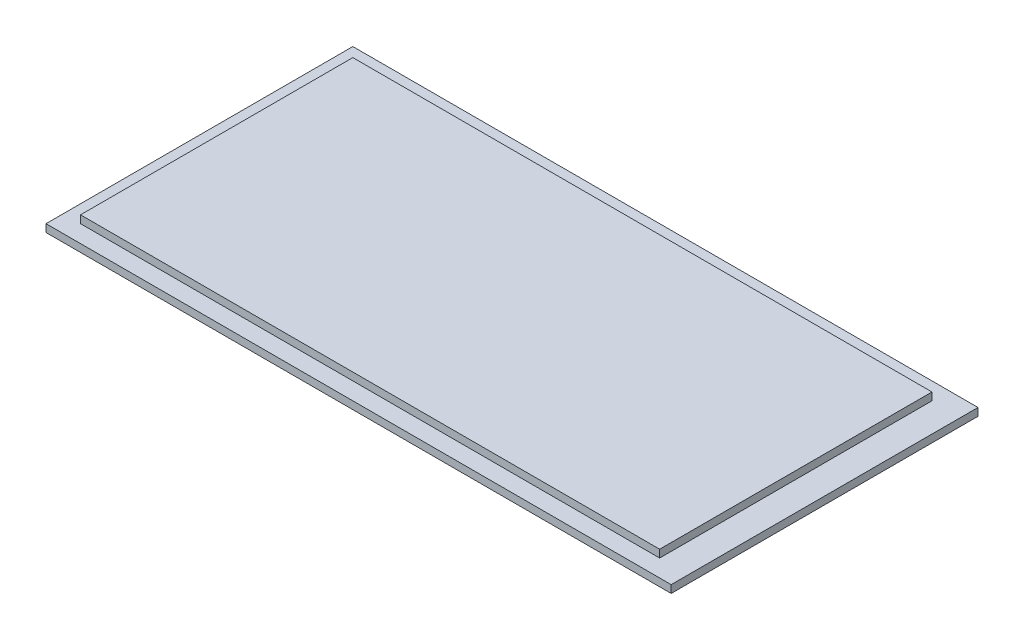
ISO-10303-21;
HEADER;
FILE_DESCRIPTION(('STEP AP214'),'2;1');
FILE_NAME('part.step','',(''),(''),'','','');
FILE_SCHEMA(('AUTOMOTIVE_DESIGN { 1 0 10303 214 1 1 1 1 }'));
ENDSEC;
DATA;
#1=APPLICATION_CONTEXT('core data for automotive mechanical design processes');
#2=APPLICATION_PROTOCOL_DEFINITION('international standard','automotive_design',2000,#1);
#3=PRODUCT_CONTEXT('',#1,'mechanical');
#4=PRODUCT('Part','Part','',(#3));
#5=PRODUCT_RELATED_PRODUCT_CATEGORY('part','',(#4));
#6=PRODUCT_DEFINITION_FORMATION('','',#4);
#7=PRODUCT_DEFINITION_CONTEXT('part definition',#1,'design');
#8=PRODUCT_DEFINITION('design','',#6,#7);
#9=PRODUCT_DEFINITION_SHAPE('','',#8);
#10=(LENGTH_UNIT() NAMED_UNIT(*) SI_UNIT(.MILLI.,.METRE.));
#11=(NAMED_UNIT(*) PLANE_ANGLE_UNIT() SI_UNIT($,.RADIAN.));
#12=(NAMED_UNIT(*) SI_UNIT($,.STERADIAN.) SOLID_ANGLE_UNIT());
#13=UNCERTAINTY_MEASURE_WITH_UNIT(LENGTH_MEASURE(1.E-05),#10,'distance_accuracy_value','');
#14=(GEOMETRIC_REPRESENTATION_CONTEXT(3) GLOBAL_UNCERTAINTY_ASSIGNED_CONTEXT((#13)) GLOBAL_UNIT_ASSIGNED_CONTEXT((#10,
#11,#12)) REPRESENTATION_CONTEXT('',''));
#15=CARTESIAN_POINT('',(0.,0.,0.));
#16=DIRECTION('',(0.,0.,1.));
#17=DIRECTION('',(1.,0.,0.));
#18=AXIS2_PLACEMENT_3D('',#15,#16,#17);
#19=CARTESIAN_POINT('',(81.5,2.,-40.));
#20=DIRECTION('',(-1.,0.,0.));
#21=DIRECTION('',(0.,0.,1.));
#22=AXIS2_PLACEMENT_3D('',#19,#20,#21);
#23=PLANE('',#22);
#24=DIRECTION('',(0.,0.,-1.));
#25=VECTOR('',#24,1.);
#26=CARTESIAN_POINT('',(81.5,0.,-40.));
#27=LINE('',#26,#25);
#28=CARTESIAN_POINT('',(81.5,0.,40.));
#29=VERTEX_POINT('',#28);
#30=CARTESIAN_POINT('',(81.5,0.,-40.));
#31=VERTEX_POINT('',#30);
#32=EDGE_CURVE('E123',#29,#31,#27,.T.);
#33=ORIENTED_EDGE('',*,*,#32,.T.);
#34=DIRECTION('',(0.,-1.,0.));
#35=VECTOR('',#34,1.);
#36=CARTESIAN_POINT('',(81.5,2.,-40.));
#37=LINE('',#36,#35);
#38=CARTESIAN_POINT('',(81.5,2.,-40.));
#39=VERTEX_POINT('',#38);
#40=EDGE_CURVE('E11',#39,#31,#37,.T.);
#41=ORIENTED_EDGE('',*,*,#40,.F.);
#42=DIRECTION('',(0.,0.,-1.));
#43=VECTOR('',#42,1.);
#44=CARTESIAN_POINT('',(81.5,2.,-40.));
#45=LINE('',#44,#43);
#46=CARTESIAN_POINT('',(81.5,2.,40.));
#47=VERTEX_POINT('',#46);
#48=EDGE_CURVE('E131',#47,#39,#45,.T.);
#49=ORIENTED_EDGE('',*,*,#48,.F.);
#50=DIRECTION('',(0.,-1.,0.));
#51=VECTOR('',#50,1.);
#52=CARTESIAN_POINT('',(81.5,2.,40.));
#53=LINE('',#52,#51);
#54=EDGE_CURVE('E143',#47,#29,#53,.T.);
#55=ORIENTED_EDGE('',*,*,#54,.T.);
#56=EDGE_LOOP('',(#33,#41,#49,#55));
#57=FACE_BOUND('',#56,.T.);
#58=ADVANCED_FACE('F39',(#57),#23,.F.);
#59=CARTESIAN_POINT('',(-81.5,2.,-40.));
#60=DIRECTION('',(0.,0.,1.));
#61=DIRECTION('',(1.,0.,0.));
#62=AXIS2_PLACEMENT_3D('',#59,#60,#61);
#63=PLANE('',#62);
#64=DIRECTION('',(-1.,0.,0.));
#65=VECTOR('',#64,1.);
#66=CARTESIAN_POINT('',(-81.5,0.,-40.));
#67=LINE('',#66,#65);
#68=CARTESIAN_POINT('',(-81.5,0.,-40.));
#69=VERTEX_POINT('',#68);
#70=EDGE_CURVE('E127',#31,#69,#67,.T.);
#71=ORIENTED_EDGE('',*,*,#70,.T.);
#72=DIRECTION('',(0.,-1.,0.));
#73=VECTOR('',#72,1.);
#74=CARTESIAN_POINT('',(-81.5,2.,-40.));
#75=LINE('',#74,#73);
#76=CARTESIAN_POINT('',(-81.5,2.,-40.));
#77=VERTEX_POINT('',#76);
#78=EDGE_CURVE('E46',#77,#69,#75,.T.);
#79=ORIENTED_EDGE('',*,*,#78,.F.);
#80=DIRECTION('',(-1.,0.,0.));
#81=VECTOR('',#80,1.);
#82=CARTESIAN_POINT('',(-81.5,2.,-40.));
#83=LINE('',#82,#81);
#84=EDGE_CURVE('E132',#39,#77,#83,.T.);
#85=ORIENTED_EDGE('',*,*,#84,.F.);
#86=ORIENTED_EDGE('',*,*,#40,.T.);
#87=EDGE_LOOP('',(#71,#79,#85,#86));
#88=FACE_BOUND('',#87,.T.);
#89=ADVANCED_FACE('F171',(#88),#63,.F.);
#90=CARTESIAN_POINT('',(-81.5,2.,-40.));
#91=DIRECTION('',(1.,0.,0.));
#92=DIRECTION('',(0.,0.,-1.));
#93=AXIS2_PLACEMENT_3D('',#90,#91,#92);
#94=PLANE('',#93);
#95=DIRECTION('',(0.,0.,1.));
#96=VECTOR('',#95,1.);
#97=CARTESIAN_POINT('',(-81.5,0.,-40.));
#98=LINE('',#97,#96);
#99=CARTESIAN_POINT('',(-81.5,0.,40.));
#100=VERTEX_POINT('',#99);
#101=EDGE_CURVE('E145',#69,#100,#98,.T.);
#102=ORIENTED_EDGE('',*,*,#101,.T.);
#103=DIRECTION('',(0.,-1.,0.));
#104=VECTOR('',#103,1.);
#105=CARTESIAN_POINT('',(-81.5,2.,40.));
#106=LINE('',#105,#104);
#107=CARTESIAN_POINT('',(-81.5,2.,40.));
#108=VERTEX_POINT('',#107);
#109=EDGE_CURVE('E149',#108,#100,#106,.T.);
#110=ORIENTED_EDGE('',*,*,#109,.F.);
#111=DIRECTION('',(0.,0.,1.));
#112=VECTOR('',#111,1.);
#113=CARTESIAN_POINT('',(-81.5,2.,-40.));
#114=LINE('',#113,#112);
#115=EDGE_CURVE('E138',#77,#108,#114,.T.);
#116=ORIENTED_EDGE('',*,*,#115,.F.);
#117=ORIENTED_EDGE('',*,*,#78,.T.);
#118=EDGE_LOOP('',(#102,#110,#116,#117));
#119=FACE_BOUND('',#118,.T.);
#120=ADVANCED_FACE('F156',(#119),#94,.F.);
#121=CARTESIAN_POINT('',(-81.5,2.,40.));
#122=DIRECTION('',(0.,0.,-1.));
#123=DIRECTION('',(-1.,0.,0.));
#124=AXIS2_PLACEMENT_3D('',#121,#122,#123);
#125=PLANE('',#124);
#126=DIRECTION('',(1.,0.,0.));
#127=VECTOR('',#126,1.);
#128=CARTESIAN_POINT('',(-81.5,0.,40.));
#129=LINE('',#128,#127);
#130=EDGE_CURVE('E136',#100,#29,#129,.T.);
#131=ORIENTED_EDGE('',*,*,#130,.T.);
#132=ORIENTED_EDGE('',*,*,#54,.F.);
#133=DIRECTION('',(1.,0.,0.));
#134=VECTOR('',#133,1.);
#135=CARTESIAN_POINT('',(-81.5,2.,40.));
#136=LINE('',#135,#134);
#137=EDGE_CURVE('E139',#108,#47,#136,.T.);
#138=ORIENTED_EDGE('',*,*,#137,.F.);
#139=ORIENTED_EDGE('',*,*,#109,.T.);
#140=EDGE_LOOP('',(#131,#132,#138,#139));
#141=FACE_BOUND('',#140,.T.);
#142=ADVANCED_FACE('F164',(#141),#125,.F.);
#143=CARTESIAN_POINT('',(0.,2.,0.));
#144=DIRECTION('',(0.,1.,0.));
#145=DIRECTION('',(0.,0.,1.));
#146=AXIS2_PLACEMENT_3D('',#143,#144,#145);
#147=PLANE('',#146);
#148=DIRECTION('',(0.,0.,-1.));
#149=VECTOR('',#148,1.);
#150=CARTESIAN_POINT('',(74.,2.,-35.5));
#151=LINE('',#150,#149);
#152=CARTESIAN_POINT('',(74.,2.,35.5));
#153=VERTEX_POINT('',#152);
#154=CARTESIAN_POINT('',(74.,2.,-35.5));
#155=VERTEX_POINT('',#154);
#156=EDGE_CURVE('E52',#153,#155,#151,.T.);
#157=ORIENTED_EDGE('',*,*,#156,.F.);
#158=DIRECTION('',(1.,0.,0.));
#159=VECTOR('',#158,1.);
#160=CARTESIAN_POINT('',(-77.,2.,35.5));
#161=LINE('',#160,#159);
#162=CARTESIAN_POINT('',(-77.,2.,35.5));
#163=VERTEX_POINT('',#162);
#164=EDGE_CURVE('E60',#163,#153,#161,.T.);
#165=ORIENTED_EDGE('',*,*,#164,.F.);
#166=DIRECTION('',(0.,0.,1.));
#167=VECTOR('',#166,1.);
#168=CARTESIAN_POINT('',(-77.,2.,-35.5));
#169=LINE('',#168,#167);
#170=CARTESIAN_POINT('',(-77.,2.,-35.5));
#171=VERTEX_POINT('',#170);
#172=EDGE_CURVE('E266',#171,#163,#169,.T.);
#173=ORIENTED_EDGE('',*,*,#172,.F.);
#174=DIRECTION('',(-1.,0.,0.));
#175=VECTOR('',#174,1.);
#176=CARTESIAN_POINT('',(-77.,2.,-35.5));
#177=LINE('',#176,#175);
#178=EDGE_CURVE('E275',#155,#171,#177,.T.);
#179=ORIENTED_EDGE('',*,*,#178,.F.);
#180=EDGE_LOOP('',(#157,#165,#173,#179));
#181=FACE_BOUND('',#180,.T.);
#182=ORIENTED_EDGE('',*,*,#48,.T.);
#183=ORIENTED_EDGE('',*,*,#84,.T.);
#184=ORIENTED_EDGE('',*,*,#115,.T.);
#185=ORIENTED_EDGE('',*,*,#137,.T.);
#186=EDGE_LOOP('',(#182,#183,#184,#185));
#187=FACE_BOUND('',#186,.T.);
#188=ADVANCED_FACE('F174',(#181,#187),#147,.T.);
#189=CARTESIAN_POINT('',(0.,0.,0.));
#190=DIRECTION('',(0.,1.,0.));
#191=DIRECTION('',(0.,0.,1.));
#192=AXIS2_PLACEMENT_3D('',#189,#190,#191);
#193=PLANE('',#192);
#194=ORIENTED_EDGE('',*,*,#32,.F.);
#195=ORIENTED_EDGE('',*,*,#130,.F.);
#196=ORIENTED_EDGE('',*,*,#101,.F.);
#197=ORIENTED_EDGE('',*,*,#70,.F.);
#198=EDGE_LOOP('',(#194,#195,#196,#197));
#199=FACE_BOUND('',#198,.T.);
#200=ADVANCED_FACE('F165',(#199),#193,.F.);
#201=CARTESIAN_POINT('',(74.,4.,-35.5));
#202=DIRECTION('',(-1.,0.,0.));
#203=DIRECTION('',(0.,0.,1.));
#204=AXIS2_PLACEMENT_3D('',#201,#202,#203);
#205=PLANE('',#204);
#206=ORIENTED_EDGE('',*,*,#156,.T.);
#207=DIRECTION('',(0.,-1.,0.));
#208=VECTOR('',#207,1.);
#209=CARTESIAN_POINT('',(74.,4.,-35.5));
#210=LINE('',#209,#208);
#211=CARTESIAN_POINT('',(74.,4.,-35.5));
#212=VERTEX_POINT('',#211);
#213=EDGE_CURVE('E106',#212,#155,#210,.T.);
#214=ORIENTED_EDGE('',*,*,#213,.F.);
#215=DIRECTION('',(0.,0.,-1.));
#216=VECTOR('',#215,1.);
#217=CARTESIAN_POINT('',(74.,4.,-35.5));
#218=LINE('',#217,#216);
#219=CARTESIAN_POINT('',(74.,4.,35.5));
#220=VERTEX_POINT('',#219);
#221=EDGE_CURVE('E115',#220,#212,#218,.T.);
#222=ORIENTED_EDGE('',*,*,#221,.F.);
#223=DIRECTION('',(0.,-1.,0.));
#224=VECTOR('',#223,1.);
#225=CARTESIAN_POINT('',(74.,4.,35.5));
#226=LINE('',#225,#224);
#227=EDGE_CURVE('E262',#220,#153,#226,.T.);
#228=ORIENTED_EDGE('',*,*,#227,.T.);
#229=EDGE_LOOP('',(#206,#214,#222,#228));
#230=FACE_BOUND('',#229,.T.);
#231=ADVANCED_FACE('F125',(#230),#205,.F.);
#232=CARTESIAN_POINT('',(-77.,4.,-35.5));
#233=DIRECTION('',(0.,0.,1.));
#234=DIRECTION('',(1.,0.,0.));
#235=AXIS2_PLACEMENT_3D('',#232,#233,#234);
#236=PLANE('',#235);
#237=ORIENTED_EDGE('',*,*,#178,.T.);
#238=DIRECTION('',(0.,-1.,0.));
#239=VECTOR('',#238,1.);
#240=CARTESIAN_POINT('',(-77.,4.,-35.5));
#241=LINE('',#240,#239);
#242=CARTESIAN_POINT('',(-77.,4.,-35.5));
#243=VERTEX_POINT('',#242);
#244=EDGE_CURVE('E107',#243,#171,#241,.T.);
#245=ORIENTED_EDGE('',*,*,#244,.F.);
#246=DIRECTION('',(-1.,0.,0.));
#247=VECTOR('',#246,1.);
#248=CARTESIAN_POINT('',(-77.,4.,-35.5));
#249=LINE('',#248,#247);
#250=EDGE_CURVE('E101',#212,#243,#249,.T.);
#251=ORIENTED_EDGE('',*,*,#250,.F.);
#252=ORIENTED_EDGE('',*,*,#213,.T.);
#253=EDGE_LOOP('',(#237,#245,#251,#252));
#254=FACE_BOUND('',#253,.T.);
#255=ADVANCED_FACE('F102',(#254),#236,.F.);
#256=CARTESIAN_POINT('',(-77.,4.,-35.5));
#257=DIRECTION('',(1.,0.,0.));
#258=DIRECTION('',(0.,0.,-1.));
#259=AXIS2_PLACEMENT_3D('',#256,#257,#258);
#260=PLANE('',#259);
#261=ORIENTED_EDGE('',*,*,#172,.T.);
#262=DIRECTION('',(0.,-1.,0.));
#263=VECTOR('',#262,1.);
#264=CARTESIAN_POINT('',(-77.,4.,35.5));
#265=LINE('',#264,#263);
#266=CARTESIAN_POINT('',(-77.,4.,35.5));
#267=VERTEX_POINT('',#266);
#268=EDGE_CURVE('E126',#267,#163,#265,.T.);
#269=ORIENTED_EDGE('',*,*,#268,.F.);
#270=DIRECTION('',(0.,0.,1.));
#271=VECTOR('',#270,1.);
#272=CARTESIAN_POINT('',(-77.,4.,-35.5));
#273=LINE('',#272,#271);
#274=EDGE_CURVE('E112',#243,#267,#273,.T.);
#275=ORIENTED_EDGE('',*,*,#274,.F.);
#276=ORIENTED_EDGE('',*,*,#244,.T.);
#277=EDGE_LOOP('',(#261,#269,#275,#276));
#278=FACE_BOUND('',#277,.T.);
#279=ADVANCED_FACE('F187',(#278),#260,.F.);
#280=CARTESIAN_POINT('',(-77.,4.,35.5));
#281=DIRECTION('',(0.,0.,-1.));
#282=DIRECTION('',(-1.,0.,0.));
#283=AXIS2_PLACEMENT_3D('',#280,#281,#282);
#284=PLANE('',#283);
#285=ORIENTED_EDGE('',*,*,#164,.T.);
#286=ORIENTED_EDGE('',*,*,#227,.F.);
#287=DIRECTION('',(1.,0.,0.));
#288=VECTOR('',#287,1.);
#289=CARTESIAN_POINT('',(-77.,4.,35.5));
#290=LINE('',#289,#288);
#291=EDGE_CURVE('E116',#267,#220,#290,.T.);
#292=ORIENTED_EDGE('',*,*,#291,.F.);
#293=ORIENTED_EDGE('',*,*,#268,.T.);
#294=EDGE_LOOP('',(#285,#286,#292,#293));
#295=FACE_BOUND('',#294,.T.);
#296=ADVANCED_FACE('F193',(#295),#284,.F.);
#297=CARTESIAN_POINT('',(0.,4.,0.));
#298=DIRECTION('',(0.,1.,0.));
#299=DIRECTION('',(0.,0.,1.));
#300=AXIS2_PLACEMENT_3D('',#297,#298,#299);
#301=PLANE('',#300);
#302=ORIENTED_EDGE('',*,*,#221,.T.);
#303=ORIENTED_EDGE('',*,*,#250,.T.);
#304=ORIENTED_EDGE('',*,*,#274,.T.);
#305=ORIENTED_EDGE('',*,*,#291,.T.);
#306=EDGE_LOOP('',(#302,#303,#304,#305));
#307=FACE_BOUND('',#306,.T.);
#308=ADVANCED_FACE('F113',(#307),#301,.T.);
#309=CLOSED_SHELL('',(#58,#89,#120,#142,#188,#200,#231,#255,#279,#296,#308));
#310=MANIFOLD_SOLID_BREP('B2',#309);
#311=ADVANCED_BREP_SHAPE_REPRESENTATION('',(#18,#310),#14);
#312=SHAPE_DEFINITION_REPRESENTATION(#9,#311);
ENDSEC;
END-ISO-10303-21;
